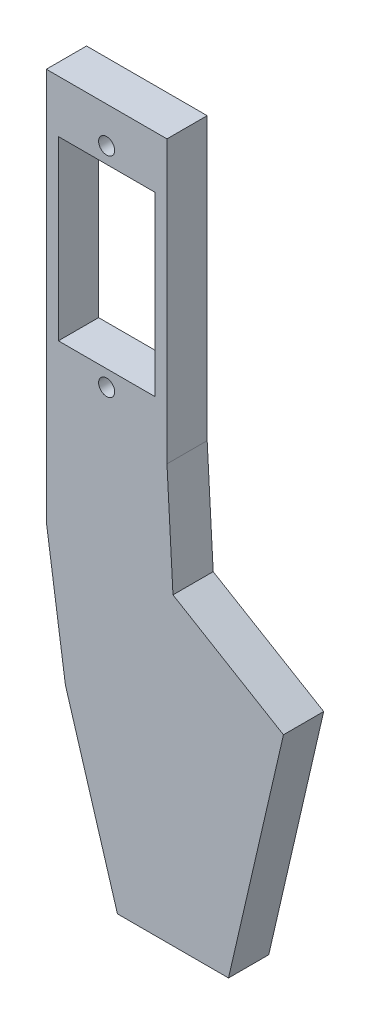
ISO-10303-21;
HEADER;
FILE_DESCRIPTION(('STEP AP214'),'2;1');
FILE_NAME('part.step','',(''),(''),'','','');
FILE_SCHEMA(('AUTOMOTIVE_DESIGN { 1 0 10303 214 1 1 1 1 }'));
ENDSEC;
DATA;
#1=APPLICATION_CONTEXT('core data for automotive mechanical design processes');
#2=APPLICATION_PROTOCOL_DEFINITION('international standard','automotive_design',2000,#1);
#3=PRODUCT_CONTEXT('',#1,'mechanical');
#4=PRODUCT('Part','Part','',(#3));
#5=PRODUCT_RELATED_PRODUCT_CATEGORY('part','',(#4));
#6=PRODUCT_DEFINITION_FORMATION('','',#4);
#7=PRODUCT_DEFINITION_CONTEXT('part definition',#1,'design');
#8=PRODUCT_DEFINITION('design','',#6,#7);
#9=PRODUCT_DEFINITION_SHAPE('','',#8);
#10=(LENGTH_UNIT() NAMED_UNIT(*) SI_UNIT(.MILLI.,.METRE.));
#11=(NAMED_UNIT(*) PLANE_ANGLE_UNIT() SI_UNIT($,.RADIAN.));
#12=(NAMED_UNIT(*) SI_UNIT($,.STERADIAN.) SOLID_ANGLE_UNIT());
#13=UNCERTAINTY_MEASURE_WITH_UNIT(LENGTH_MEASURE(1.E-05),#10,'distance_accuracy_value','');
#14=(GEOMETRIC_REPRESENTATION_CONTEXT(3) GLOBAL_UNCERTAINTY_ASSIGNED_CONTEXT((#13)) GLOBAL_UNIT_ASSIGNED_CONTEXT((#10,
#11,#12)) REPRESENTATION_CONTEXT('',''));
#15=CARTESIAN_POINT('',(0.,0.,0.));
#16=DIRECTION('',(0.,0.,1.));
#17=DIRECTION('',(1.,0.,0.));
#18=AXIS2_PLACEMENT_3D('',#15,#16,#17);
#19=CARTESIAN_POINT('',(-7.65410958904109,17.9280821917808,5.));
#20=DIRECTION('',(-1.,0.,0.));
#21=DIRECTION('',(0.,-1.,0.));
#22=AXIS2_PLACEMENT_3D('',#19,#20,#21);
#23=PLANE('',#22);
#24=DIRECTION('',(0.,1.,0.));
#25=VECTOR('',#24,1.);
#26=CARTESIAN_POINT('',(-7.65410958904109,17.9280821917808,0.));
#27=LINE('',#26,#25);
#28=CARTESIAN_POINT('',(-7.65410958904108,-17.0719178082192,0.));
#29=VERTEX_POINT('',#28);
#30=CARTESIAN_POINT('',(-7.65410958904109,17.9280821917808,0.));
#31=VERTEX_POINT('',#30);
#32=EDGE_CURVE('E204',#29,#31,#27,.T.);
#33=ORIENTED_EDGE('',*,*,#32,.T.);
#34=DIRECTION('',(0.,0.,-1.));
#35=VECTOR('',#34,1.);
#36=CARTESIAN_POINT('',(-7.65410958904109,17.9280821917808,5.));
#37=LINE('',#36,#35);
#38=CARTESIAN_POINT('',(-7.65410958904109,17.9280821917808,5.));
#39=VERTEX_POINT('',#38);
#40=EDGE_CURVE('E11',#39,#31,#37,.T.);
#41=ORIENTED_EDGE('',*,*,#40,.F.);
#42=DIRECTION('',(0.,1.,0.));
#43=VECTOR('',#42,1.);
#44=CARTESIAN_POINT('',(-7.65410958904109,17.9280821917808,5.));
#45=LINE('',#44,#43);
#46=CARTESIAN_POINT('',(-7.65410958904108,-17.0719178082192,5.));
#47=VERTEX_POINT('',#46);
#48=EDGE_CURVE('E143',#47,#39,#45,.T.);
#49=ORIENTED_EDGE('',*,*,#48,.F.);
#50=DIRECTION('',(0.,0.,-1.));
#51=VECTOR('',#50,1.);
#52=CARTESIAN_POINT('',(-7.65410958904108,-17.0719178082192,5.));
#53=LINE('',#52,#51);
#54=EDGE_CURVE('E247',#47,#29,#53,.T.);
#55=ORIENTED_EDGE('',*,*,#54,.T.);
#56=EDGE_LOOP('',(#33,#41,#49,#55));
#57=FACE_BOUND('',#56,.T.);
#58=ADVANCED_FACE('F39',(#57),#23,.F.);
#59=CARTESIAN_POINT('',(-22.6541095890411,17.9280821917808,5.));
#60=DIRECTION('',(0.,-1.,0.));
#61=DIRECTION('',(0.,0.,-1.));
#62=AXIS2_PLACEMENT_3D('',#59,#60,#61);
#63=PLANE('',#62);
#64=DIRECTION('',(-1.,0.,0.));
#65=VECTOR('',#64,1.);
#66=CARTESIAN_POINT('',(-22.6541095890411,17.9280821917808,0.));
#67=LINE('',#66,#65);
#68=CARTESIAN_POINT('',(-22.6541095890411,17.9280821917808,0.));
#69=VERTEX_POINT('',#68);
#70=EDGE_CURVE('E144',#31,#69,#67,.T.);
#71=ORIENTED_EDGE('',*,*,#70,.T.);
#72=DIRECTION('',(0.,0.,-1.));
#73=VECTOR('',#72,1.);
#74=CARTESIAN_POINT('',(-22.6541095890411,17.9280821917808,5.));
#75=LINE('',#74,#73);
#76=CARTESIAN_POINT('',(-22.6541095890411,17.9280821917808,5.));
#77=VERTEX_POINT('',#76);
#78=EDGE_CURVE('E46',#77,#69,#75,.T.);
#79=ORIENTED_EDGE('',*,*,#78,.F.);
#80=DIRECTION('',(-1.,0.,0.));
#81=VECTOR('',#80,1.);
#82=CARTESIAN_POINT('',(-22.6541095890411,17.9280821917808,5.));
#83=LINE('',#82,#81);
#84=EDGE_CURVE('E243',#39,#77,#83,.T.);
#85=ORIENTED_EDGE('',*,*,#84,.F.);
#86=ORIENTED_EDGE('',*,*,#40,.T.);
#87=EDGE_LOOP('',(#71,#79,#85,#86));
#88=FACE_BOUND('',#87,.T.);
#89=ADVANCED_FACE('F275',(#88),#63,.F.);
#90=CARTESIAN_POINT('',(-22.6541095890411,17.9280821917808,5.));
#91=DIRECTION('',(1.,0.,0.));
#92=DIRECTION('',(0.,1.,0.));
#93=AXIS2_PLACEMENT_3D('',#90,#91,#92);
#94=PLANE('',#93);
#95=DIRECTION('',(0.,-1.,0.));
#96=VECTOR('',#95,1.);
#97=CARTESIAN_POINT('',(-22.6541095890411,17.9280821917808,0.));
#98=LINE('',#97,#96);
#99=CARTESIAN_POINT('',(-22.6541095890411,-30.8042337719795,0.));
#100=VERTEX_POINT('',#99);
#101=EDGE_CURVE('E134',#69,#100,#98,.T.);
#102=ORIENTED_EDGE('',*,*,#101,.T.);
#103=DIRECTION('',(0.,0.,1.));
#104=VECTOR('',#103,1.);
#105=CARTESIAN_POINT('',(-22.6541095890411,-30.8042337719795,0.));
#106=LINE('',#105,#104);
#107=CARTESIAN_POINT('',(-22.6541095890411,-30.8042337719795,5.));
#108=VERTEX_POINT('',#107);
#109=EDGE_CURVE('E138',#100,#108,#106,.T.);
#110=ORIENTED_EDGE('',*,*,#109,.T.);
#111=DIRECTION('',(0.,-1.,0.));
#112=VECTOR('',#111,1.);
#113=CARTESIAN_POINT('',(-22.6541095890411,17.9280821917808,5.));
#114=LINE('',#113,#112);
#115=EDGE_CURVE('E245',#77,#108,#114,.T.);
#116=ORIENTED_EDGE('',*,*,#115,.F.);
#117=ORIENTED_EDGE('',*,*,#78,.T.);
#118=EDGE_LOOP('',(#102,#110,#116,#117));
#119=FACE_BOUND('',#118,.T.);
#120=ADVANCED_FACE('F136',(#119),#94,.F.);
#121=CARTESIAN_POINT('',(0.,0.,5.));
#122=DIRECTION('',(0.,0.,1.));
#123=DIRECTION('',(1.,0.,0.));
#124=AXIS2_PLACEMENT_3D('',#121,#122,#123);
#125=PLANE('',#124);
#126=CARTESIAN_POINT('',(-15.1541095890411,-12.5719178082192,5.));
#127=DIRECTION('',(0.,0.,1.));
#128=DIRECTION('',(1.,0.,0.));
#129=AXIS2_PLACEMENT_3D('',#126,#127,#128);
#130=CIRCLE('',#129,1.);
#131=CARTESIAN_POINT('',(-14.1541095890411,-12.5719178082192,5.));
#132=VERTEX_POINT('',#131);
#133=EDGE_CURVE('E205',#132,#132,#130,.T.);
#134=ORIENTED_EDGE('',*,*,#133,.F.);
#135=EDGE_LOOP('',(#134));
#136=FACE_BOUND('',#135,.T.);
#137=DIRECTION('',(0.,1.,0.));
#138=VECTOR('',#137,1.);
#139=CARTESIAN_POINT('',(-9.15410958904108,-10.5719178082192,5.));
#140=LINE('',#139,#138);
#141=CARTESIAN_POINT('',(-9.15410958904108,-10.5719178082192,5.));
#142=VERTEX_POINT('',#141);
#143=CARTESIAN_POINT('',(-9.15410958904108,11.4280821917808,5.));
#144=VERTEX_POINT('',#143);
#145=EDGE_CURVE('E53',#142,#144,#140,.T.);
#146=ORIENTED_EDGE('',*,*,#145,.F.);
#147=DIRECTION('',(1.,0.,0.));
#148=VECTOR('',#147,1.);
#149=CARTESIAN_POINT('',(-21.1541095890411,-10.5719178082192,5.));
#150=LINE('',#149,#148);
#151=CARTESIAN_POINT('',(-21.1541095890411,-10.5719178082192,5.));
#152=VERTEX_POINT('',#151);
#153=EDGE_CURVE('E218',#152,#142,#150,.T.);
#154=ORIENTED_EDGE('',*,*,#153,.F.);
#155=DIRECTION('',(0.,-1.,0.));
#156=VECTOR('',#155,1.);
#157=CARTESIAN_POINT('',(-21.1541095890411,11.4280821917808,5.));
#158=LINE('',#157,#156);
#159=CARTESIAN_POINT('',(-21.1541095890411,11.4280821917808,5.));
#160=VERTEX_POINT('',#159);
#161=EDGE_CURVE('E221',#160,#152,#158,.T.);
#162=ORIENTED_EDGE('',*,*,#161,.F.);
#163=DIRECTION('',(-1.,0.,0.));
#164=VECTOR('',#163,1.);
#165=CARTESIAN_POINT('',(-9.15410958904108,11.4280821917808,5.));
#166=LINE('',#165,#164);
#167=EDGE_CURVE('E225',#144,#160,#166,.T.);
#168=ORIENTED_EDGE('',*,*,#167,.F.);
#169=EDGE_LOOP('',(#146,#154,#162,#168));
#170=FACE_BOUND('',#169,.T.);
#171=CARTESIAN_POINT('',(-15.1541095890411,13.4280821917808,5.));
#172=DIRECTION('',(0.,0.,1.));
#173=DIRECTION('',(1.,0.,0.));
#174=AXIS2_PLACEMENT_3D('',#171,#172,#173);
#175=CIRCLE('',#174,1.);
#176=CARTESIAN_POINT('',(-14.1541095890411,13.4280821917808,5.));
#177=VERTEX_POINT('',#176);
#178=EDGE_CURVE('E217',#177,#177,#175,.T.);
#179=ORIENTED_EDGE('',*,*,#178,.F.);
#180=EDGE_LOOP('',(#179));
#181=FACE_BOUND('',#180,.T.);
#182=ORIENTED_EDGE('',*,*,#48,.T.);
#183=ORIENTED_EDGE('',*,*,#84,.T.);
#184=ORIENTED_EDGE('',*,*,#115,.T.);
#185=DIRECTION('',(0.143226569163282,-0.989689926131268,0.));
#186=VECTOR('',#185,1.);
#187=CARTESIAN_POINT('',(-22.6541095890411,-30.8042337719795,5.));
#188=LINE('',#187,#186);
#189=CARTESIAN_POINT('',(-20.282646178594,-47.1909521107583,5.));
#190=VERTEX_POINT('',#189);
#191=EDGE_CURVE('E152',#108,#190,#188,.T.);
#192=ORIENTED_EDGE('',*,*,#191,.T.);
#193=DIRECTION('',(0.289253089214845,-0.957252657546412,0.));
#194=VECTOR('',#193,1.);
#195=CARTESIAN_POINT('',(-17.3594317969403,-56.8650224655869,5.));
#196=LINE('',#195,#194);
#197=CARTESIAN_POINT('',(-13.811210888402,-68.6074861449885,5.));
#198=VERTEX_POINT('',#197);
#199=EDGE_CURVE('E180',#190,#198,#196,.T.);
#200=ORIENTED_EDGE('',*,*,#199,.T.);
#201=DIRECTION('',(1.,0.,0.));
#202=VECTOR('',#201,1.);
#203=CARTESIAN_POINT('',(-13.811210888402,-68.6074861449885,5.));
#204=LINE('',#203,#202);
#205=CARTESIAN_POINT('',(0.,-68.6074861449885,5.));
#206=VERTEX_POINT('',#205);
#207=EDGE_CURVE('E183',#198,#206,#204,.T.);
#208=ORIENTED_EDGE('',*,*,#207,.T.);
#209=DIRECTION('',(0.224839555531073,0.974395799595108,0.));
#210=VECTOR('',#209,1.);
#211=CARTESIAN_POINT('',(0.,-68.6074861449885,5.));
#212=LINE('',#211,#210);
#213=CARTESIAN_POINT('',(6.83241371729101,-38.9975929413689,5.));
#214=VERTEX_POINT('',#213);
#215=EDGE_CURVE('E186',#206,#214,#212,.T.);
#216=ORIENTED_EDGE('',*,*,#215,.T.);
#217=DIRECTION('',(-0.858853849263092,0.512220719617989,0.));
#218=VECTOR('',#217,1.);
#219=CARTESIAN_POINT('',(6.83241371729101,-38.9975929413689,5.));
#220=LINE('',#219,#218);
#221=CARTESIAN_POINT('',(-6.90560544420102,-30.8042337719795,5.));
#222=VERTEX_POINT('',#221);
#223=EDGE_CURVE('E166',#214,#222,#220,.T.);
#224=ORIENTED_EDGE('',*,*,#223,.T.);
#225=DIRECTION('',(-0.054425977380064,0.998517808046619,0.));
#226=VECTOR('',#225,1.);
#227=CARTESIAN_POINT('',(-6.90560544420102,-30.8042337719795,5.));
#228=LINE('',#227,#226);
#229=EDGE_CURVE('E161',#222,#47,#228,.T.);
#230=ORIENTED_EDGE('',*,*,#229,.T.);
#231=EDGE_LOOP('',(#182,#183,#184,#192,#200,#208,#216,#224,#230));
#232=FACE_BOUND('',#231,.T.);
#233=ADVANCED_FACE('F273',(#136,#170,#181,#232),#125,.T.);
#234=CARTESIAN_POINT('',(0.,0.,0.));
#235=DIRECTION('',(0.,0.,1.));
#236=DIRECTION('',(1.,0.,0.));
#237=AXIS2_PLACEMENT_3D('',#234,#235,#236);
#238=PLANE('',#237);
#239=CARTESIAN_POINT('',(-15.1541095890411,-12.5719178082192,0.));
#240=DIRECTION('',(0.,0.,1.));
#241=DIRECTION('',(1.,0.,0.));
#242=AXIS2_PLACEMENT_3D('',#239,#240,#241);
#243=CIRCLE('',#242,1.);
#244=CARTESIAN_POINT('',(-14.1541095890411,-12.5719178082192,0.));
#245=VERTEX_POINT('',#244);
#246=EDGE_CURVE('E201',#245,#245,#243,.T.);
#247=ORIENTED_EDGE('',*,*,#246,.T.);
#248=EDGE_LOOP('',(#247));
#249=FACE_BOUND('',#248,.T.);
#250=DIRECTION('',(1.,0.,0.));
#251=VECTOR('',#250,1.);
#252=CARTESIAN_POINT('',(-21.1541095890411,-10.5719178082192,0.));
#253=LINE('',#252,#251);
#254=CARTESIAN_POINT('',(-21.1541095890411,-10.5719178082192,0.));
#255=VERTEX_POINT('',#254);
#256=CARTESIAN_POINT('',(-9.15410958904108,-10.5719178082192,0.));
#257=VERTEX_POINT('',#256);
#258=EDGE_CURVE('E210',#255,#257,#253,.T.);
#259=ORIENTED_EDGE('',*,*,#258,.T.);
#260=DIRECTION('',(0.,1.,0.));
#261=VECTOR('',#260,1.);
#262=CARTESIAN_POINT('',(-9.15410958904108,-10.5719178082192,0.));
#263=LINE('',#262,#261);
#264=CARTESIAN_POINT('',(-9.15410958904108,11.4280821917808,0.));
#265=VERTEX_POINT('',#264);
#266=EDGE_CURVE('E222',#257,#265,#263,.T.);
#267=ORIENTED_EDGE('',*,*,#266,.T.);
#268=DIRECTION('',(-1.,0.,0.));
#269=VECTOR('',#268,1.);
#270=CARTESIAN_POINT('',(-9.15410958904108,11.4280821917808,0.));
#271=LINE('',#270,#269);
#272=CARTESIAN_POINT('',(-21.1541095890411,11.4280821917808,0.));
#273=VERTEX_POINT('',#272);
#274=EDGE_CURVE('E232',#265,#273,#271,.T.);
#275=ORIENTED_EDGE('',*,*,#274,.T.);
#276=DIRECTION('',(0.,-1.,0.));
#277=VECTOR('',#276,1.);
#278=CARTESIAN_POINT('',(-21.1541095890411,11.4280821917808,0.));
#279=LINE('',#278,#277);
#280=EDGE_CURVE('E61',#273,#255,#279,.T.);
#281=ORIENTED_EDGE('',*,*,#280,.T.);
#282=EDGE_LOOP('',(#259,#267,#275,#281));
#283=FACE_BOUND('',#282,.T.);
#284=CARTESIAN_POINT('',(-15.1541095890411,13.4280821917808,0.));
#285=DIRECTION('',(0.,0.,1.));
#286=DIRECTION('',(1.,0.,0.));
#287=AXIS2_PLACEMENT_3D('',#284,#285,#286);
#288=CIRCLE('',#287,1.);
#289=CARTESIAN_POINT('',(-14.1541095890411,13.4280821917808,0.));
#290=VERTEX_POINT('',#289);
#291=EDGE_CURVE('E193',#290,#290,#288,.T.);
#292=ORIENTED_EDGE('',*,*,#291,.T.);
#293=EDGE_LOOP('',(#292));
#294=FACE_BOUND('',#293,.T.);
#295=ORIENTED_EDGE('',*,*,#32,.F.);
#296=DIRECTION('',(-0.054425977380064,0.998517808046619,0.));
#297=VECTOR('',#296,1.);
#298=CARTESIAN_POINT('',(-6.90560544420102,-30.8042337719795,0.));
#299=LINE('',#298,#297);
#300=CARTESIAN_POINT('',(-6.90560544420102,-30.8042337719795,0.));
#301=VERTEX_POINT('',#300);
#302=EDGE_CURVE('E154',#301,#29,#299,.T.);
#303=ORIENTED_EDGE('',*,*,#302,.F.);
#304=DIRECTION('',(-0.858853849263092,0.512220719617989,0.));
#305=VECTOR('',#304,1.);
#306=CARTESIAN_POINT('',(6.83241371729101,-38.9975929413689,0.));
#307=LINE('',#306,#305);
#308=CARTESIAN_POINT('',(6.83241371729101,-38.9975929413689,0.));
#309=VERTEX_POINT('',#308);
#310=EDGE_CURVE('E174',#309,#301,#307,.T.);
#311=ORIENTED_EDGE('',*,*,#310,.F.);
#312=DIRECTION('',(0.224839555531073,0.974395799595108,0.));
#313=VECTOR('',#312,1.);
#314=CARTESIAN_POINT('',(0.,-68.6074861449885,0.));
#315=LINE('',#314,#313);
#316=CARTESIAN_POINT('',(0.,-68.6074861449885,0.));
#317=VERTEX_POINT('',#316);
#318=EDGE_CURVE('E171',#317,#309,#315,.T.);
#319=ORIENTED_EDGE('',*,*,#318,.F.);
#320=DIRECTION('',(1.,0.,0.));
#321=VECTOR('',#320,1.);
#322=CARTESIAN_POINT('',(-13.811210888402,-68.6074861449885,0.));
#323=LINE('',#322,#321);
#324=CARTESIAN_POINT('',(-13.811210888402,-68.6074861449885,0.));
#325=VERTEX_POINT('',#324);
#326=EDGE_CURVE('E163',#325,#317,#323,.T.);
#327=ORIENTED_EDGE('',*,*,#326,.F.);
#328=DIRECTION('',(0.289253089214845,-0.957252657546412,0.));
#329=VECTOR('',#328,1.);
#330=CARTESIAN_POINT('',(-20.282646178594,-47.1909521107583,0.));
#331=LINE('',#330,#329);
#332=CARTESIAN_POINT('',(-20.282646178594,-47.1909521107583,0.));
#333=VERTEX_POINT('',#332);
#334=EDGE_CURVE('E160',#333,#325,#331,.T.);
#335=ORIENTED_EDGE('',*,*,#334,.F.);
#336=DIRECTION('',(0.143226569163282,-0.989689926131268,0.));
#337=VECTOR('',#336,1.);
#338=CARTESIAN_POINT('',(-22.6541095890411,-30.8042337719795,0.));
#339=LINE('',#338,#337);
#340=EDGE_CURVE('E150',#100,#333,#339,.T.);
#341=ORIENTED_EDGE('',*,*,#340,.F.);
#342=ORIENTED_EDGE('',*,*,#101,.F.);
#343=ORIENTED_EDGE('',*,*,#70,.F.);
#344=EDGE_LOOP('',(#295,#303,#311,#319,#327,#335,#341,#342,#343));
#345=FACE_BOUND('',#344,.T.);
#346=ADVANCED_FACE('F158',(#249,#283,#294,#345),#238,.F.);
#347=CARTESIAN_POINT('',(-15.1541095890411,13.4280821917808,0.));
#348=DIRECTION('',(0.,0.,1.));
#349=DIRECTION('',(1.,0.,0.));
#350=AXIS2_PLACEMENT_3D('',#347,#348,#349);
#351=CYLINDRICAL_SURFACE('',#350,1.);
#352=ORIENTED_EDGE('',*,*,#291,.F.);
#353=EDGE_LOOP('',(#352));
#354=FACE_BOUND('',#353,.T.);
#355=ORIENTED_EDGE('',*,*,#178,.T.);
#356=EDGE_LOOP('',(#355));
#357=FACE_BOUND('',#356,.T.);
#358=ADVANCED_FACE('F286',(#354,#357),#351,.F.);
#359=CARTESIAN_POINT('',(-9.15410958904108,-10.5719178082192,0.));
#360=DIRECTION('',(1.,0.,0.));
#361=DIRECTION('',(0.,0.,-1.));
#362=AXIS2_PLACEMENT_3D('',#359,#360,#361);
#363=PLANE('',#362);
#364=ORIENTED_EDGE('',*,*,#145,.T.);
#365=DIRECTION('',(0.,0.,1.));
#366=VECTOR('',#365,1.);
#367=CARTESIAN_POINT('',(-9.15410958904108,11.4280821917808,0.));
#368=LINE('',#367,#366);
#369=EDGE_CURVE('E208',#265,#144,#368,.T.);
#370=ORIENTED_EDGE('',*,*,#369,.F.);
#371=ORIENTED_EDGE('',*,*,#266,.F.);
#372=DIRECTION('',(0.,0.,1.));
#373=VECTOR('',#372,1.);
#374=CARTESIAN_POINT('',(-9.15410958904108,-10.5719178082192,0.));
#375=LINE('',#374,#373);
#376=EDGE_CURVE('E215',#257,#142,#375,.T.);
#377=ORIENTED_EDGE('',*,*,#376,.T.);
#378=EDGE_LOOP('',(#364,#370,#371,#377));
#379=FACE_BOUND('',#378,.T.);
#380=ADVANCED_FACE('F292',(#379),#363,.F.);
#381=CARTESIAN_POINT('',(-21.1541095890411,-10.5719178082192,0.));
#382=DIRECTION('',(0.,-1.,0.));
#383=DIRECTION('',(0.,0.,-1.));
#384=AXIS2_PLACEMENT_3D('',#381,#382,#383);
#385=PLANE('',#384);
#386=ORIENTED_EDGE('',*,*,#153,.T.);
#387=ORIENTED_EDGE('',*,*,#376,.F.);
#388=ORIENTED_EDGE('',*,*,#258,.F.);
#389=DIRECTION('',(0.,0.,1.));
#390=VECTOR('',#389,1.);
#391=CARTESIAN_POINT('',(-21.1541095890411,-10.5719178082192,0.));
#392=LINE('',#391,#390);
#393=EDGE_CURVE('E213',#255,#152,#392,.T.);
#394=ORIENTED_EDGE('',*,*,#393,.T.);
#395=EDGE_LOOP('',(#386,#387,#388,#394));
#396=FACE_BOUND('',#395,.T.);
#397=ADVANCED_FACE('F294',(#396),#385,.F.);
#398=CARTESIAN_POINT('',(-21.1541095890411,11.4280821917808,0.));
#399=DIRECTION('',(-1.,0.,0.));
#400=DIRECTION('',(0.,0.,1.));
#401=AXIS2_PLACEMENT_3D('',#398,#399,#400);
#402=PLANE('',#401);
#403=ORIENTED_EDGE('',*,*,#161,.T.);
#404=ORIENTED_EDGE('',*,*,#393,.F.);
#405=ORIENTED_EDGE('',*,*,#280,.F.);
#406=DIRECTION('',(0.,0.,1.));
#407=VECTOR('',#406,1.);
#408=CARTESIAN_POINT('',(-21.1541095890411,11.4280821917808,0.));
#409=LINE('',#408,#407);
#410=EDGE_CURVE('E211',#273,#160,#409,.T.);
#411=ORIENTED_EDGE('',*,*,#410,.T.);
#412=EDGE_LOOP('',(#403,#404,#405,#411));
#413=FACE_BOUND('',#412,.T.);
#414=ADVANCED_FACE('F297',(#413),#402,.F.);
#415=CARTESIAN_POINT('',(-9.15410958904108,11.4280821917808,0.));
#416=DIRECTION('',(0.,1.,0.));
#417=DIRECTION('',(-1.,0.,0.));
#418=AXIS2_PLACEMENT_3D('',#415,#416,#417);
#419=PLANE('',#418);
#420=ORIENTED_EDGE('',*,*,#167,.T.);
#421=ORIENTED_EDGE('',*,*,#410,.F.);
#422=ORIENTED_EDGE('',*,*,#274,.F.);
#423=ORIENTED_EDGE('',*,*,#369,.T.);
#424=EDGE_LOOP('',(#420,#421,#422,#423));
#425=FACE_BOUND('',#424,.T.);
#426=ADVANCED_FACE('F301',(#425),#419,.F.);
#427=CARTESIAN_POINT('',(-15.1541095890411,-12.5719178082192,0.));
#428=DIRECTION('',(0.,0.,1.));
#429=DIRECTION('',(1.,0.,0.));
#430=AXIS2_PLACEMENT_3D('',#427,#428,#429);
#431=CYLINDRICAL_SURFACE('',#430,1.);
#432=ORIENTED_EDGE('',*,*,#246,.F.);
#433=EDGE_LOOP('',(#432));
#434=FACE_BOUND('',#433,.T.);
#435=ORIENTED_EDGE('',*,*,#133,.T.);
#436=EDGE_LOOP('',(#435));
#437=FACE_BOUND('',#436,.T.);
#438=ADVANCED_FACE('F304',(#434,#437),#431,.F.);
#439=CARTESIAN_POINT('',(-6.90560544420102,-30.8042337719795,0.));
#440=DIRECTION('',(0.998517808046619,0.054425977380064,0.));
#441=DIRECTION('',(-0.054425977380064,0.998517808046619,0.));
#442=AXIS2_PLACEMENT_3D('',#439,#440,#441);
#443=PLANE('',#442);
#444=ORIENTED_EDGE('',*,*,#229,.F.);
#445=DIRECTION('',(0.,0.,1.));
#446=VECTOR('',#445,1.);
#447=CARTESIAN_POINT('',(-6.90560544420102,-30.8042337719795,0.));
#448=LINE('',#447,#446);
#449=EDGE_CURVE('E191',#301,#222,#448,.T.);
#450=ORIENTED_EDGE('',*,*,#449,.F.);
#451=ORIENTED_EDGE('',*,*,#302,.T.);
#452=ORIENTED_EDGE('',*,*,#54,.F.);
#453=EDGE_LOOP('',(#444,#450,#451,#452));
#454=FACE_BOUND('',#453,.T.);
#455=ADVANCED_FACE('F258',(#454),#443,.T.);
#456=CARTESIAN_POINT('',(6.83241371729101,-38.9975929413689,0.));
#457=DIRECTION('',(0.512220719617989,0.858853849263092,0.));
#458=DIRECTION('',(-0.858853849263092,0.512220719617989,0.));
#459=AXIS2_PLACEMENT_3D('',#456,#457,#458);
#460=PLANE('',#459);
#461=ORIENTED_EDGE('',*,*,#223,.F.);
#462=DIRECTION('',(0.,0.,1.));
#463=VECTOR('',#462,1.);
#464=CARTESIAN_POINT('',(6.83241371729101,-38.9975929413689,0.));
#465=LINE('',#464,#463);
#466=EDGE_CURVE('E194',#309,#214,#465,.T.);
#467=ORIENTED_EDGE('',*,*,#466,.F.);
#468=ORIENTED_EDGE('',*,*,#310,.T.);
#469=ORIENTED_EDGE('',*,*,#449,.T.);
#470=EDGE_LOOP('',(#461,#467,#468,#469));
#471=FACE_BOUND('',#470,.T.);
#472=ADVANCED_FACE('F261',(#471),#460,.T.);
#473=CARTESIAN_POINT('',(0.,-68.6074861449885,0.));
#474=DIRECTION('',(0.974395799595108,-0.224839555531073,0.));
#475=DIRECTION('',(0.224839555531073,0.974395799595108,0.));
#476=AXIS2_PLACEMENT_3D('',#473,#474,#475);
#477=PLANE('',#476);
#478=ORIENTED_EDGE('',*,*,#215,.F.);
#479=DIRECTION('',(0.,0.,1.));
#480=VECTOR('',#479,1.);
#481=CARTESIAN_POINT('',(0.,-68.6074861449885,0.));
#482=LINE('',#481,#480);
#483=EDGE_CURVE('E196',#317,#206,#482,.T.);
#484=ORIENTED_EDGE('',*,*,#483,.F.);
#485=ORIENTED_EDGE('',*,*,#318,.T.);
#486=ORIENTED_EDGE('',*,*,#466,.T.);
#487=EDGE_LOOP('',(#478,#484,#485,#486));
#488=FACE_BOUND('',#487,.T.);
#489=ADVANCED_FACE('F265',(#488),#477,.T.);
#490=CARTESIAN_POINT('',(-13.811210888402,-68.6074861449885,0.));
#491=DIRECTION('',(0.,-1.,0.));
#492=DIRECTION('',(0.,0.,-1.));
#493=AXIS2_PLACEMENT_3D('',#490,#491,#492);
#494=PLANE('',#493);
#495=ORIENTED_EDGE('',*,*,#207,.F.);
#496=DIRECTION('',(0.,0.,1.));
#497=VECTOR('',#496,1.);
#498=CARTESIAN_POINT('',(-13.811210888402,-68.6074861449885,0.));
#499=LINE('',#498,#497);
#500=EDGE_CURVE('E198',#325,#198,#499,.T.);
#501=ORIENTED_EDGE('',*,*,#500,.F.);
#502=ORIENTED_EDGE('',*,*,#326,.T.);
#503=ORIENTED_EDGE('',*,*,#483,.T.);
#504=EDGE_LOOP('',(#495,#501,#502,#503));
#505=FACE_BOUND('',#504,.T.);
#506=ADVANCED_FACE('F268',(#505),#494,.T.);
#507=CARTESIAN_POINT('',(-17.3594317969403,-56.8650224655869,0.));
#508=DIRECTION('',(-0.957252657546412,-0.289253089214845,0.));
#509=DIRECTION('',(0.289253089214845,-0.957252657546412,0.));
#510=AXIS2_PLACEMENT_3D('',#507,#508,#509);
#511=PLANE('',#510);
#512=ORIENTED_EDGE('',*,*,#199,.F.);
#513=DIRECTION('',(0.,0.,1.));
#514=VECTOR('',#513,1.);
#515=CARTESIAN_POINT('',(-20.282646178594,-47.1909521107583,0.));
#516=LINE('',#515,#514);
#517=EDGE_CURVE('E153',#333,#190,#516,.T.);
#518=ORIENTED_EDGE('',*,*,#517,.F.);
#519=ORIENTED_EDGE('',*,*,#334,.T.);
#520=ORIENTED_EDGE('',*,*,#500,.T.);
#521=EDGE_LOOP('',(#512,#518,#519,#520));
#522=FACE_BOUND('',#521,.T.);
#523=ADVANCED_FACE('F271',(#522),#511,.T.);
#524=CARTESIAN_POINT('',(-22.6541095890411,-30.8042337719795,0.));
#525=DIRECTION('',(-0.989689926131268,-0.143226569163282,0.));
#526=DIRECTION('',(0.143226569163282,-0.989689926131269,0.));
#527=AXIS2_PLACEMENT_3D('',#524,#525,#526);
#528=PLANE('',#527);
#529=ORIENTED_EDGE('',*,*,#191,.F.);
#530=ORIENTED_EDGE('',*,*,#109,.F.);
#531=ORIENTED_EDGE('',*,*,#340,.T.);
#532=ORIENTED_EDGE('',*,*,#517,.T.);
#533=EDGE_LOOP('',(#529,#530,#531,#532));
#534=FACE_BOUND('',#533,.T.);
#535=ADVANCED_FACE('F148',(#534),#528,.T.);
#536=CLOSED_SHELL('',(#58,#89,#120,#233,#346,#358,#380,#397,#414,#426,#438,#455,#472,#489,#506,
#523,#535));
#537=MANIFOLD_SOLID_BREP('B2',#536);
#538=ADVANCED_BREP_SHAPE_REPRESENTATION('',(#18,#537),#14);
#539=SHAPE_DEFINITION_REPRESENTATION(#9,#538);
ENDSEC;
END-ISO-10303-21;
